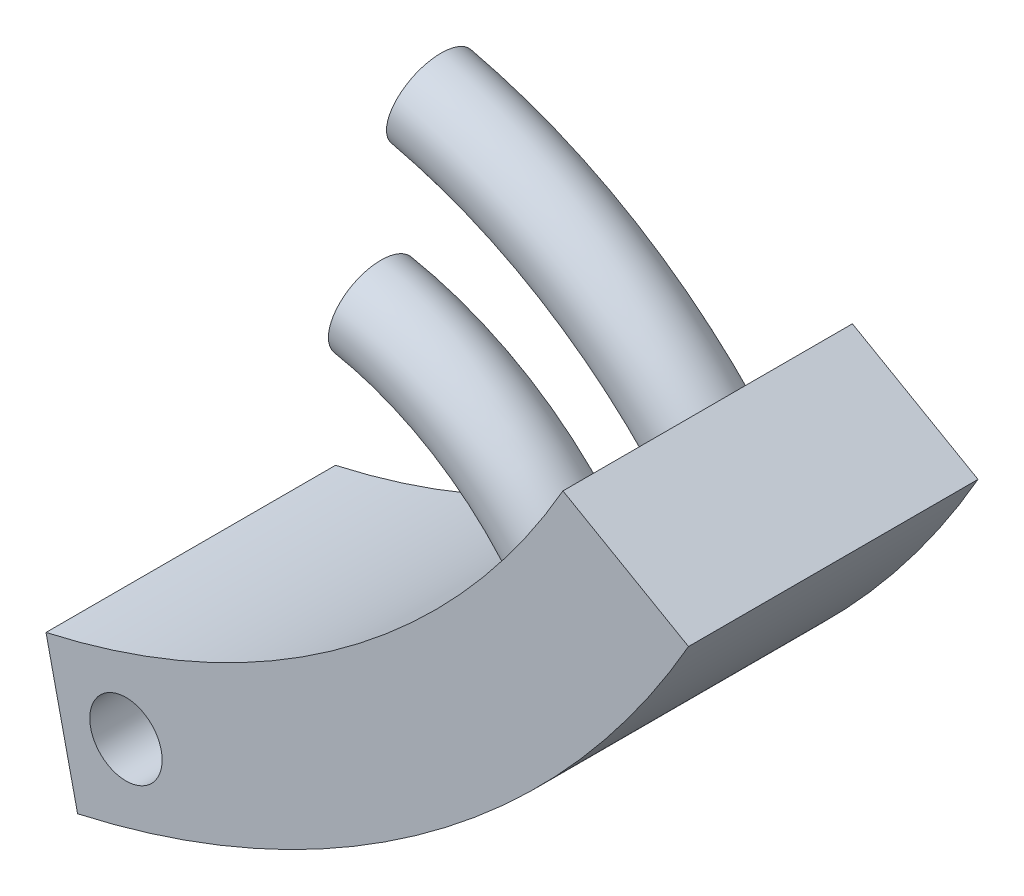
ISO-10303-21;
HEADER;
FILE_DESCRIPTION(('STEP AP214'),'2;1');
FILE_NAME('part.step','',(''),(''),'','','');
FILE_SCHEMA(('AUTOMOTIVE_DESIGN { 1 0 10303 214 1 1 1 1 }'));
ENDSEC;
DATA;
#1=APPLICATION_CONTEXT('core data for automotive mechanical design processes');
#2=APPLICATION_PROTOCOL_DEFINITION('international standard','automotive_design',2000,#1);
#3=PRODUCT_CONTEXT('',#1,'mechanical');
#4=PRODUCT('Part','Part','',(#3));
#5=PRODUCT_RELATED_PRODUCT_CATEGORY('part','',(#4));
#6=PRODUCT_DEFINITION_FORMATION('','',#4);
#7=PRODUCT_DEFINITION_CONTEXT('part definition',#1,'design');
#8=PRODUCT_DEFINITION('design','',#6,#7);
#9=PRODUCT_DEFINITION_SHAPE('','',#8);
#10=(LENGTH_UNIT() NAMED_UNIT(*) SI_UNIT(.MILLI.,.METRE.));
#11=(NAMED_UNIT(*) PLANE_ANGLE_UNIT() SI_UNIT($,.RADIAN.));
#12=(NAMED_UNIT(*) SI_UNIT($,.STERADIAN.) SOLID_ANGLE_UNIT());
#13=UNCERTAINTY_MEASURE_WITH_UNIT(LENGTH_MEASURE(1.E-05),#10,'distance_accuracy_value','');
#14=(GEOMETRIC_REPRESENTATION_CONTEXT(3) GLOBAL_UNCERTAINTY_ASSIGNED_CONTEXT((#13)) GLOBAL_UNIT_ASSIGNED_CONTEXT((#10,
#11,#12)) REPRESENTATION_CONTEXT('',''));
#15=CARTESIAN_POINT('',(0.,0.,0.));
#16=DIRECTION('',(0.,0.,1.));
#17=DIRECTION('',(1.,0.,0.));
#18=AXIS2_PLACEMENT_3D('',#15,#16,#17);
#19=CARTESIAN_POINT('',(-24.0074560773892,107.348227990462,40.));
#20=DIRECTION('',(0.,0.,-1.));
#21=DIRECTION('',(-1.,0.,0.));
#22=AXIS2_PLACEMENT_3D('',#19,#20,#21);
#23=CYLINDRICAL_SURFACE('',#22,110.);
#24=CARTESIAN_POINT('',(41.4872896276513,18.9715439327759,11.8788723896433));
#25=CARTESIAN_POINT('',(41.5581029483642,19.0240227829249,11.7346778512814));
#26=CARTESIAN_POINT('',(41.6337398664815,19.0802077786677,11.5942249832102));
#27=CARTESIAN_POINT('',(41.7940965349835,19.1996847735885,11.3217114701984));
#28=CARTESIAN_POINT('',(41.8788186824328,19.2629786485966,11.1896530547771));
#29=CARTESIAN_POINT('',(42.0567365252339,19.3963387409074,10.9347971907029));
#30=CARTESIAN_POINT('',(42.1499397928316,19.4664110137949,10.8120082006427));
#31=CARTESIAN_POINT('',(42.3440632635298,19.6128835347469,10.5766428327947));
#32=CARTESIAN_POINT('',(42.4449862844209,19.6892860942868,10.464070217188));
#33=CARTESIAN_POINT('',(42.6536445466986,19.8478576198827,10.2500803844772));
#34=CARTESIAN_POINT('',(42.7613736191462,19.930021371267,10.1486532873129));
#35=CARTESIAN_POINT('',(42.9829422277576,20.0996978668108,9.95752042492524));
#36=CARTESIAN_POINT('',(43.0967840008628,20.1872125707978,9.86781899252025));
#37=CARTESIAN_POINT('',(43.3296059109855,20.36695590176,9.70087053645461));
#38=CARTESIAN_POINT('',(43.4485828053261,20.4591815604687,9.62361579484584));
#39=CARTESIAN_POINT('',(43.690892842352,20.6478408199491,9.4820178801333));
#40=CARTESIAN_POINT('',(43.8142275749008,20.7442759595436,9.41767947768758));
#41=CARTESIAN_POINT('',(44.0643137314607,20.9407084178919,9.30240259320062));
#42=CARTESIAN_POINT('',(44.1910657145626,21.0407063204147,9.25146631870787));
#43=CARTESIAN_POINT('',(44.4470777145705,21.2436201580217,9.16336032275113));
#44=CARTESIAN_POINT('',(44.5763386415629,21.3465371584593,9.12619569883163));
#45=CARTESIAN_POINT('',(44.8363309542722,21.5545179114067,9.06594225260509));
#46=CARTESIAN_POINT('',(44.9670618271794,21.6595809250948,9.04284866765544));
#47=CARTESIAN_POINT('',(45.2291355419176,21.8711974093372,9.01088393379467));
#48=CARTESIAN_POINT('',(45.3604785914881,21.9777514148066,9.00201802846852));
#49=CARTESIAN_POINT('',(45.6224538770229,22.1912897898739,8.99860041465761));
#50=CARTESIAN_POINT('',(45.7530870695226,22.2982724104221,9.00401286984684));
#51=CARTESIAN_POINT('',(46.0130917933011,22.5122024127321,9.02904605142538));
#52=CARTESIAN_POINT('',(46.1424628412584,22.6191497669257,9.04867201973605));
#53=CARTESIAN_POINT('',(46.3989462171863,22.8321568978966,9.1020008217509));
#54=CARTESIAN_POINT('',(46.5260593857459,22.9382169968673,9.13569829717284));
#55=CARTESIAN_POINT('',(46.7772022964633,23.1487085789267,9.21691802306479));
#56=CARTESIAN_POINT('',(46.9012308836372,23.2531394466731,9.26444536981828));
#57=CARTESIAN_POINT('',(47.2668507316443,23.5623435006888,9.42710422908561));
#58=CARTESIAN_POINT('',(47.5027270019068,23.7636525632089,9.56246980532891));
#59=CARTESIAN_POINT('',(47.9522283389836,24.1503189632157,9.88322848031221));
#60=CARTESIAN_POINT('',(48.1658534287533,24.3356763171589,10.0686215274407));
#61=CARTESIAN_POINT('',(48.5654604654844,24.6848005823746,10.4842499562183));
#62=CARTESIAN_POINT('',(48.7514395468562,24.848565255304,10.7144899806812));
#63=CARTESIAN_POINT('',(49.0909268630662,25.1492134698724,11.2132601833072));
#64=CARTESIAN_POINT('',(49.2444349188901,25.2860968633132,11.4817905725534));
#65=CARTESIAN_POINT('',(49.5152543635945,25.5286445392429,12.0497743347548));
#66=CARTESIAN_POINT('',(49.6325359709995,25.6342831326172,12.3492528814794));
#67=CARTESIAN_POINT('',(49.8278264593756,25.8107000029427,12.9704557813343));
#68=CARTESIAN_POINT('',(49.9058353518229,25.8814782900807,13.292180127964));
#69=CARTESIAN_POINT('',(50.0206787726625,25.98582062592,13.9487908152241));
#70=CARTESIAN_POINT('',(50.0575078615316,26.0193797582634,14.2836788886313));
#71=CARTESIAN_POINT('',(50.0890756406162,26.0481390531663,14.9570661655943));
#72=CARTESIAN_POINT('',(50.08381439035,26.0433392699676,15.295565364043));
#73=CARTESIAN_POINT('',(50.031336771969,25.9955489752729,15.9664708304101));
#74=CARTESIAN_POINT('',(49.9841315542482,25.9525686137114,16.2988786936825));
#75=CARTESIAN_POINT('',(49.848931674191,25.8298726992145,16.9482614071567));
#76=CARTESIAN_POINT('',(49.7609369360814,25.7501570780373,17.265236228688));
#77=CARTESIAN_POINT('',(49.5463018736307,25.5566302112383,17.8748050803442));
#78=CARTESIAN_POINT('',(49.419656205013,25.4428142505915,18.1673957317352));
#79=CARTESIAN_POINT('',(49.1308665393597,25.1848351492631,18.7198505234656));
#80=CARTESIAN_POINT('',(48.9687224768668,25.0406719526227,18.9797146034574));
#81=CARTESIAN_POINT('',(48.6129969367196,24.7266450749255,19.4593828257447));
#82=CARTESIAN_POINT('',(48.4194103021541,24.5567771783415,19.6791803841395));
#83=CARTESIAN_POINT('',(48.0058061944814,24.1967692366009,20.0724166766981));
#84=CARTESIAN_POINT('',(47.7857888547793,24.006629293765,20.2458556448354));
#85=CARTESIAN_POINT('',(47.3252663659396,23.6121278072934,20.5413553580938));
#86=CARTESIAN_POINT('',(47.084773622788,23.4077748888087,20.6634469517777));
#87=CARTESIAN_POINT('',(46.5896837167929,22.9909610472309,20.8529415717925));
#88=CARTESIAN_POINT('',(46.3350866445329,22.7785001762129,20.9203449493087));
#89=CARTESIAN_POINT('',(45.8190073599826,22.3518928310308,20.9985543800373));
#90=CARTESIAN_POINT('',(45.5575298188548,22.137747566288,21.0093978838473));
#91=CARTESIAN_POINT('',(45.0349010632275,21.713736418787,20.9743210920529));
#92=CARTESIAN_POINT('',(44.7737498499912,21.5038705525474,20.9284005773817));
#93=CARTESIAN_POINT('',(44.2590798014445,21.0940192921413,20.7811204337107));
#94=CARTESIAN_POINT('',(44.0055686118108,20.8940436751384,20.679707095419));
#95=CARTESIAN_POINT('',(43.513727088045,20.5093700298796,20.4241800849142));
#96=CARTESIAN_POINT('',(43.2753970458567,20.3246722954074,20.270065399581));
#97=CARTESIAN_POINT('',(42.9346390705925,20.0626237476258,20.0027297726687));
#98=CARTESIAN_POINT('',(42.8236660891888,19.9776406301719,19.9073952003878));
#99=CARTESIAN_POINT('',(42.6081913868737,19.8132417542047,19.7053239422896));
#100=CARTESIAN_POINT('',(42.5036873049488,19.7338239630488,19.5985914556979));
#101=CARTESIAN_POINT('',(42.3019131382971,19.5810154405481,19.3744269974837));
#102=CARTESIAN_POINT('',(42.2046458238628,19.5076270161839,19.2569909663468));
#103=CARTESIAN_POINT('',(42.0181671568072,19.3673739286546,19.0123214463919));
#104=CARTESIAN_POINT('',(41.9289528341448,19.3005068595964,18.8850916019926));
#105=CARTESIAN_POINT('',(41.7591388383575,19.1735930398642,18.6215333196601));
#106=CARTESIAN_POINT('',(41.6785497859302,19.1135546921392,18.4851939926646));
#107=CARTESIAN_POINT('',(41.5267791546721,19.0007721622188,18.2045712514125));
#108=CARTESIAN_POINT('',(41.4555940884834,18.9480252757318,18.0602908103026));
#109=CARTESIAN_POINT('',(41.32314701859,18.8500975682805,17.7647139049625));
#110=CARTESIAN_POINT('',(41.2618882136382,18.80491918612,17.613415199209));
#111=CARTESIAN_POINT('',(41.1498403654288,18.72243286614,17.3049786567719));
#112=CARTESIAN_POINT('',(41.0990474029802,18.6851219820206,17.1478430319781));
#113=CARTESIAN_POINT('',(41.0084333220448,18.6186541295225,16.8292015948345));
#114=CARTESIAN_POINT('',(40.9685849450474,18.5894769007501,16.6677077604904));
#115=CARTESIAN_POINT('',(40.900032442065,18.5393335088511,16.3411843246308));
#116=CARTESIAN_POINT('',(40.8713241496564,18.5183642758848,16.1761560694129));
#117=CARTESIAN_POINT('',(40.8252550513629,18.4847350191718,15.843585661385));
#118=CARTESIAN_POINT('',(40.8079009813452,18.4720799277526,15.6760420765355));
#119=CARTESIAN_POINT('',(40.7847165588596,18.4551766783434,15.3398006815927));
#120=CARTESIAN_POINT('',(40.7788819150342,18.4509253896653,15.1711033248273));
#121=CARTESIAN_POINT('',(40.778772391199,18.4508455730962,14.8341977431629));
#122=CARTESIAN_POINT('',(40.7844636701187,18.4549923876738,14.6659895342703));
#123=CARTESIAN_POINT('',(40.8072862590218,18.4716316659259,14.3308292463329));
#124=CARTESIAN_POINT('',(40.8244133651719,18.484121062851,14.1638767284915));
#125=CARTESIAN_POINT('',(40.8699430753418,18.5173556967242,13.832494369242));
#126=CARTESIAN_POINT('',(40.8983358810544,18.5380937594592,13.6680624642782));
#127=CARTESIAN_POINT('',(40.9661499471253,18.5876946561533,13.342793032156));
#128=CARTESIAN_POINT('',(41.005568376059,18.6165554041857,13.1819545936171));
#129=CARTESIAN_POINT('',(41.1067407579352,18.6907619715886,12.8238291998541));
#130=CARTESIAN_POINT('',(41.1716357624784,18.7384417198665,12.6279005810957));
#131=CARTESIAN_POINT('',(41.3175987431462,18.8459940462366,12.2456519784958));
#132=CARTESIAN_POINT('',(41.3986666949873,18.9058666060214,12.0593319802276));
#133=CARTESIAN_POINT('',(41.4872896276513,18.9715439327759,11.8788723896433));
#134=B_SPLINE_CURVE_WITH_KNOTS('',3,(#24,#25,#26,#27,#28,#29,#30,#31,#32,#33,#34,#35,#36,#37,
#38,#39,#40,#41,#42,#43,#44,#45,#46,#47,#48,#49,#50,#51,#52,#53,#54,#55,#56,#57,#58,#59,#60,#61,
#62,#63,#64,#65,#66,#67,#68,#69,#70,#71,#72,#73,#74,#75,#76,#77,#78,#79,#80,#81,#82,#83,#84,#85,
#86,#87,#88,#89,#90,#91,#92,#93,#94,#95,#96,#97,#98,#99,#100,#101,#102,#103,#104,#105,#106,#107,
#108,#109,#110,#111,#112,#113,#114,#115,#116,#117,#118,#119,#120,#121,#122,#123,#124,#125,#126,
#127,#128,#129,#130,#131,#132,#133),.UNSPECIFIED.,.T.,.F.,(4,2,2,2,2,2,2,2,2,2,2,2,2,2,2,2,2,2,
2,2,2,2,2,2,2,2,2,2,2,2,2,2,2,2,2,2,2,2,2,2,2,2,2,2,2,2,2,2,2,2,2,2,2,2,4),(0.,
0.506811149602438,1.01375634777578,1.52115869084737,2.02874713308038,2.53588192534999,
3.04320358538181,3.55020944431666,4.0574022230494,4.56467849245837,5.07214234188464,
5.57943433381824,6.08691324437376,6.5931196792186,7.09951289733307,7.60571346180965,
8.11210079704624,9.12194537712251,10.1317889153839,11.141737054003,12.1516907603727,
13.1624725453775,14.1732540350148,15.18416902505,16.1950825855933,17.2057274850206,
18.2163742618962,19.2271608445858,20.237949291131,21.2489036852847,22.2598529770155,
23.2701940382764,24.2805286114889,25.2901941160012,26.2998635170829,27.3105118698593,
28.3211796522302,28.8282621706904,29.3351585098863,29.8422479051728,30.3491495089945,
30.8566682723424,31.3639982968002,31.8714914853849,32.3787942839457,32.8848218976547,
33.390660072757,33.8967980637797,34.4027474664812,34.9072135132738,35.4114942193466,
35.9153372868866,36.4190510840908,37.053326632412,37.6876012283832),.UNSPECIFIED.);
#135=CARTESIAN_POINT('',(41.4872896276513,18.9715439327759,11.8788723896433));
#136=VERTEX_POINT('',#135);
#137=EDGE_CURVE('E55',#136,#136,#134,.T.);
#138=ORIENTED_EDGE('',*,*,#137,.T.);
#139=EDGE_LOOP('',(#138));
#140=FACE_BOUND('',#139,.T.);
#141=CARTESIAN_POINT('',(-24.0074560773892,107.348227990462,0.));
#142=DIRECTION('',(0.,0.,-1.));
#143=DIRECTION('',(1.,0.,0.));
#144=AXIS2_PLACEMENT_3D('',#141,#142,#143);
#145=CIRCLE('',#144,110.);
#146=CARTESIAN_POINT('',(71.4284233444876,52.6491153927882,0.));
#147=VERTEX_POINT('',#146);
#148=CARTESIAN_POINT('',(0.,0.,0.));
#149=VERTEX_POINT('',#148);
#150=EDGE_CURVE('E132',#147,#149,#145,.T.);
#151=ORIENTED_EDGE('',*,*,#150,.T.);
#152=DIRECTION('',(0.,0.,-1.));
#153=VECTOR('',#152,1.);
#154=CARTESIAN_POINT('',(0.,0.,40.));
#155=LINE('',#154,#153);
#156=CARTESIAN_POINT('',(0.,0.,40.));
#157=VERTEX_POINT('',#156);
#158=EDGE_CURVE('E113',#157,#149,#155,.T.);
#159=ORIENTED_EDGE('',*,*,#158,.F.);
#160=CARTESIAN_POINT('',(-24.0074560773892,107.348227990462,40.));
#161=DIRECTION('',(0.,0.,-1.));
#162=DIRECTION('',(1.,0.,0.));
#163=AXIS2_PLACEMENT_3D('',#160,#161,#162);
#164=CIRCLE('',#163,110.);
#165=CARTESIAN_POINT('',(71.4284233444876,52.6491153927882,40.));
#166=VERTEX_POINT('',#165);
#167=EDGE_CURVE('E149',#166,#157,#164,.T.);
#168=ORIENTED_EDGE('',*,*,#167,.F.);
#169=DIRECTION('',(0.,0.,-1.));
#170=VECTOR('',#169,1.);
#171=CARTESIAN_POINT('',(71.4284233444876,52.6491153927882,40.));
#172=LINE('',#171,#170);
#173=EDGE_CURVE('E134',#166,#147,#172,.T.);
#174=ORIENTED_EDGE('',*,*,#173,.T.);
#175=EDGE_LOOP('',(#151,#159,#168,#174));
#176=FACE_BOUND('',#175,.T.);
#177=DIRECTION('',(0.,0.,-1.));
#178=VECTOR('',#177,1.);
#179=CARTESIAN_POINT('',(67.7433866517025,46.6705314413883,40.));
#180=LINE('',#179,#178);
#181=CARTESIAN_POINT('',(67.7433866517025,46.6705314413883,9.950269974268));
#182=VERTEX_POINT('',#181);
#183=CARTESIAN_POINT('',(67.7433866517025,46.6705314413883,20.049730025732));
#184=VERTEX_POINT('',#183);
#185=EDGE_CURVE('E12',#182,#184,#180,.F.);
#186=ORIENTED_EDGE('',*,*,#185,.F.);
#187=CARTESIAN_POINT('',(62.2159762759423,39.0436182396519,14.9258049793913));
#188=CARTESIAN_POINT('',(62.2172578141374,39.0452405187402,14.7594064808959));
#189=CARTESIAN_POINT('',(62.2229247099796,39.0523897365476,14.5930999605847));
#190=CARTESIAN_POINT('',(62.2429167858489,39.0776369135093,14.2618486827113));
#191=CARTESIAN_POINT('',(62.2572416941051,39.0957345289989,14.09690388257));
#192=CARTESIAN_POINT('',(62.2944674831785,39.1428114507469,13.7692790082415));
#193=CARTESIAN_POINT('',(62.3173821719542,39.1718082775481,13.6066030202011));
#194=CARTESIAN_POINT('',(62.3715739362299,39.2404817594897,13.2849489109374));
#195=CARTESIAN_POINT('',(62.4028506433368,39.2801579441459,13.125970627145));
#196=CARTESIAN_POINT('',(62.4739116125329,39.3704641431152,12.8109539374715));
#197=CARTESIAN_POINT('',(62.5137930049329,39.4212193014103,12.6549733060825));
#198=CARTESIAN_POINT('',(62.6014754393999,39.5330525003628,12.349055014605));
#199=CARTESIAN_POINT('',(62.6492764826192,39.5941305425222,12.1991173553958));
#200=CARTESIAN_POINT('',(62.7522241834461,39.7260063703442,11.9067597864921));
#201=CARTESIAN_POINT('',(62.8073501902428,39.7967768473486,11.7643202587336));
#202=CARTESIAN_POINT('',(62.9245439207001,39.9476605770607,11.4875635667824));
#203=CARTESIAN_POINT('',(62.9866074898214,40.0277682394371,11.3532416148744));
#204=CARTESIAN_POINT('',(63.0754602526426,40.1428176866745,11.1765022851233));
#205=CARTESIAN_POINT('',(63.0994772783039,40.1739489714204,11.1301511903523));
#206=CARTESIAN_POINT('',(63.1483248092202,40.2373387111674,11.0386585427653));
#207=CARTESIAN_POINT('',(63.1731553726123,40.2695972467353,10.993517076813));
#208=CARTESIAN_POINT('',(63.2693745661346,40.3947486706138,10.8237086046077));
#209=CARTESIAN_POINT('',(63.3435006655346,40.4914675512345,10.7033468755067));
#210=CARTESIAN_POINT('',(63.497366580912,40.6929799435672,10.4733433545429));
#211=CARTESIAN_POINT('',(63.5771098216889,40.7977783851725,10.363708201753));
#212=CARTESIAN_POINT('',(63.7416736160077,41.0149118810061,10.1557426665914));
#213=CARTESIAN_POINT('',(63.8265041206316,41.1272617619312,10.057435617355));
#214=CARTESIAN_POINT('',(64.0004189921805,41.3585707058738,9.87300467335599));
#215=CARTESIAN_POINT('',(64.0895050026555,41.4775323254072,9.7868855375006));
#216=CARTESIAN_POINT('',(64.2709929179867,41.7209589532579,9.62758925672314));
#217=CARTESIAN_POINT('',(64.3633877158504,41.845412285448,9.5543861649608));
#218=CARTESIAN_POINT('',(64.5509709679042,42.0992440116975,9.4211370447408));
#219=CARTESIAN_POINT('',(64.6461604378142,42.2286242016214,9.36109586880465));
#220=CARTESIAN_POINT('',(64.83848456229,42.4912677000545,9.25461112610519));
#221=CARTESIAN_POINT('',(64.9356173683988,42.6245273687335,9.20815523834062));
#222=CARTESIAN_POINT('',(65.1312278054566,42.8941917271185,9.1290163090752));
#223=CARTESIAN_POINT('',(65.2297059243158,43.0305975709087,9.09633840918539));
#224=CARTESIAN_POINT('',(65.4284969787519,43.3073060656898,9.04463163326866));
#225=CARTESIAN_POINT('',(65.5288174689862,43.4476361081698,9.02577832221427));
#226=CARTESIAN_POINT('',(65.7293904397233,43.7296118188039,9.00247550291367));
#227=CARTESIAN_POINT('',(65.8296428813252,43.8712579545576,8.99803132700317));
#228=CARTESIAN_POINT('',(66.029324637919,44.1548091779208,9.00355811882878));
#229=CARTESIAN_POINT('',(66.1287541013903,44.2967142129221,9.01352642665966));
#230=CARTESIAN_POINT('',(66.3261684148349,44.5798753961674,9.04778989954147));
#231=CARTESIAN_POINT('',(66.4241527140751,44.7211312835982,9.07209038881799));
#232=CARTESIAN_POINT('',(66.6191968574272,45.0037044584527,9.13524163124978));
#233=CARTESIAN_POINT('',(66.7162299552188,45.145000564904,9.17426997174814));
#234=CARTESIAN_POINT('',(66.9074929843703,45.4248819473795,9.26658930385634));
#235=CARTESIAN_POINT('',(67.0017218549706,45.5634661909619,9.31988561831227));
#236=CARTESIAN_POINT('',(67.1866923965473,45.8368104229433,9.44037360025015));
#237=CARTESIAN_POINT('',(67.2774352437441,45.9715716971653,9.50756053118708));
#238=CARTESIAN_POINT('',(67.4548805460481,46.2363106181905,9.655390930412));
#239=CARTESIAN_POINT('',(67.5415815030986,46.3662864876721,9.73603933802826));
#240=CARTESIAN_POINT('',(67.7947290607687,46.7474734332383,9.99744394324567));
#241=CARTESIAN_POINT('',(67.9543767648166,46.9901755148864,10.1977616488732));
#242=CARTESIAN_POINT('',(68.2508770998548,47.4443561849981,10.6449616839855));
#243=CARTESIAN_POINT('',(68.3877314763387,47.6558371642061,10.8918404447742));
#244=CARTESIAN_POINT('',(68.6330394248948,48.0372742928692,11.4210733017846));
#245=CARTESIAN_POINT('',(68.7419282919976,48.2078637251662,11.7027676320902));
#246=CARTESIAN_POINT('',(68.9312586491774,48.5058398965176,12.2968877375767));
#247=CARTESIAN_POINT('',(69.0117048595829,48.6332338041348,12.6093084024206));
#248=CARTESIAN_POINT('',(69.140142722641,48.8372115159606,13.2469514421427));
#249=CARTESIAN_POINT('',(69.188953033281,48.9150759328134,13.5715993281921));
#250=CARTESIAN_POINT('',(69.2561681648955,49.0224148150069,14.2318471009435));
#251=CARTESIAN_POINT('',(69.2745774481955,49.0518963820781,14.5674453729496));
#252=CARTESIAN_POINT('',(69.2804195506381,49.0612460434071,15.2323896876918));
#253=CARTESIAN_POINT('',(69.2685065190823,49.0421618579754,15.5617159225033));
#254=CARTESIAN_POINT('',(69.2154051315194,48.9572987911532,16.2118636825349));
#255=CARTESIAN_POINT('',(69.1742177574256,48.8915214759332,16.532685492634));
#256=CARTESIAN_POINT('',(69.0637821047747,48.7158540337495,17.1561935309765));
#257=CARTESIAN_POINT('',(68.9945905370002,48.6060530624773,17.458915000304));
#258=CARTESIAN_POINT('',(68.8299212014463,48.3461524127666,18.0388225773734));
#259=CARTESIAN_POINT('',(68.7344414432454,48.196049682885,18.3160067494264));
#260=CARTESIAN_POINT('',(68.517621610669,47.8574633653316,18.8424715595241));
#261=CARTESIAN_POINT('',(68.3958431492217,47.6683319130439,19.091153631385));
#262=CARTESIAN_POINT('',(68.1303866881985,47.2593179779889,19.5485433031921));
#263=CARTESIAN_POINT('',(67.9867057146804,47.0394313195876,19.7572454659339));
#264=CARTESIAN_POINT('',(67.7554932362143,46.6886731211355,20.038851980312));
#265=CARTESIAN_POINT('',(67.6746149084726,46.5664839718536,20.1284554785733));
#266=CARTESIAN_POINT('',(67.508530809572,46.3167067558179,20.295236868936));
#267=CARTESIAN_POINT('',(67.4233264857533,46.1891204971171,20.3724188813007));
#268=CARTESIAN_POINT('',(67.2490769818412,45.9294226662119,20.5139100982176));
#269=CARTESIAN_POINT('',(67.1600300368426,45.7973090204516,20.5782133094122));
#270=CARTESIAN_POINT('',(66.9787151172733,45.529599952302,20.6934933159898));
#271=CARTESIAN_POINT('',(66.8864482764636,45.3940057598115,20.7444747495069));
#272=CARTESIAN_POINT('',(66.6972957706462,45.1173944476721,20.8337372940492));
#273=CARTESIAN_POINT('',(66.6003539341553,44.9763231997953,20.8717318339182));
#274=CARTESIAN_POINT('',(66.4043709836766,44.6925718431308,20.9332578519775));
#275=CARTESIAN_POINT('',(66.3053306213979,44.5498923187338,20.9567944214653));
#276=CARTESIAN_POINT('',(66.1057588702044,44.2638486854928,20.9892581311511));
#277=CARTESIAN_POINT('',(66.0052270329805,44.1204843799711,20.9981807850755));
#278=CARTESIAN_POINT('',(65.8034393743094,43.8341845173875,21.0013167733702));
#279=CARTESIAN_POINT('',(65.7021838376506,43.6912488200444,20.9955356069723));
#280=CARTESIAN_POINT('',(65.4991386830085,43.4060644150101,20.9692161764109));
#281=CARTESIAN_POINT('',(65.3973488714386,43.2638224701269,20.9486059903129));
#282=CARTESIAN_POINT('',(65.1945227547759,42.9817993857788,20.8926593359439));
#283=CARTESIAN_POINT('',(65.0934861800165,42.8420173385917,20.85732842376));
#284=CARTESIAN_POINT('',(64.8928063756626,42.5657263676196,20.7721004047174));
#285=CARTESIAN_POINT('',(64.7931645111545,42.4292205682592,20.7221899480629));
#286=CARTESIAN_POINT('',(64.5961928239242,42.1606438549224,20.6081389068917));
#287=CARTESIAN_POINT('',(64.4988621080356,42.0285712192672,20.5440039220358));
#288=CARTESIAN_POINT('',(64.3080914810205,41.7708725851911,20.4025145983354));
#289=CARTESIAN_POINT('',(64.2146252128475,41.6452007353193,20.3252793025303));
#290=CARTESIAN_POINT('',(64.0315053813019,41.4000311378744,20.1577445463155));
#291=CARTESIAN_POINT('',(63.94185028382,41.2805309017998,20.06745040816));
#292=CARTESIAN_POINT('',(63.76724990009,41.0487407466969,19.8745798092795));
#293=CARTESIAN_POINT('',(63.6822954890407,40.9364367863191,19.7720284598365));
#294=CARTESIAN_POINT('',(63.5176701771067,40.7196246138252,19.5552419746235));
#295=CARTESIAN_POINT('',(63.4379959689775,40.6151115166973,19.4410142685301));
#296=CARTESIAN_POINT('',(63.3333421270381,40.4783013225543,19.2777198379836));
#297=CARTESIAN_POINT('',(63.3057664531244,40.4423002694896,19.2333497629476));
#298=CARTESIAN_POINT('',(63.2514467012921,40.3714717488183,19.1432170734499));
#299=CARTESIAN_POINT('',(63.2247023557098,40.3366439031642,19.0974549167876));
#300=CARTESIAN_POINT('',(63.1111968043704,40.1890084118676,18.8971331709673));
#301=CARTESIAN_POINT('',(63.0286587836006,40.0821101775611,18.7356878612502));
#302=CARTESIAN_POINT('',(62.8739776489859,39.882440548418,18.3992813824558));
#303=CARTESIAN_POINT('',(62.801850517035,39.7896908610556,18.224300053361));
#304=CARTESIAN_POINT('',(62.6822302280422,39.6362956202806,17.8986574346358));
#305=CARTESIAN_POINT('',(62.6326856052592,39.5729277120959,17.7500221935573));
#306=CARTESIAN_POINT('',(62.5414248847749,39.4564267469479,17.4463913934239));
#307=CARTESIAN_POINT('',(62.4997117010798,39.4032974995016,17.2913934929215));
#308=CARTESIAN_POINT('',(62.4244463498024,39.3075783760667,16.975887731833));
#309=CARTESIAN_POINT('',(62.3909108826021,39.2650100643956,16.8153693472472));
#310=CARTESIAN_POINT('',(62.3324087468566,39.1908378723901,16.4903343475504));
#311=CARTESIAN_POINT('',(62.307439879376,39.1592311783274,16.325818770095));
#312=CARTESIAN_POINT('',(62.2868947042957,39.1332367996137,16.1598697054516));
#313=B_SPLINE_CURVE_WITH_KNOTS('',3,(#187,#188,#189,#190,#191,#192,#193,#194,#195,#196,#197,
#198,#199,#200,#201,#202,#203,#204,#205,#206,#207,#208,#209,#210,#211,#212,#213,#214,#215,#216,
#217,#218,#219,#220,#221,#222,#223,#224,#225,#226,#227,#228,#229,#230,#231,#232,#233,#234,#235,
#236,#237,#238,#239,#240,#241,#242,#243,#244,#245,#246,#247,#248,#249,#250,#251,#252,#253,#254,
#255,#256,#257,#258,#259,#260,#261,#262,#263,#264,#265,#266,#267,#268,#269,#270,#271,#272,#273,
#274,#275,#276,#277,#278,#279,#280,#281,#282,#283,#284,#285,#286,#287,#288,#289,#290,#291,#292,
#293,#294,#295,#296,#297,#298,#299,#300,#301,#302,#303,#304,#305,#306,#307,#308,#309,#310,#311,
#312),.UNSPECIFIED.,.F.,.F.,(4,2,2,2,2,2,2,2,2,2,2,2,2,2,2,2,2,2,2,2,2,2,2,2,2,2,2,2,2,2,2,2,2,
2,2,2,2,2,2,2,2,2,2,2,2,2,2,2,2,2,2,2,2,2,2,2,2,2,2,2,2,2,4),(0.,0.49908006746151,
0.998144469858623,1.49801457606687,1.99786266386336,2.50367951906149,3.00949644785486,
3.51391647203328,4.01803602784151,4.20035961520704,4.38269626034979,4.89583979329786,
5.40929894670946,5.92379747916646,6.43849635232767,6.95214918150622,7.46599106637123,
7.97936547333049,8.49293128997242,9.01291122089787,9.53308355693641,10.0531599044869,
10.5734295756746,11.1001841852788,11.627135581786,12.1539075892381,12.6808733081785,
13.7339232868383,14.7868925867158,15.8223140150986,16.8575635247305,17.8648233529498,
18.8719353203502,19.8575056441093,20.8430429116521,21.8265942926168,22.8102201640751,
23.8117197329151,24.8133554075665,25.3281368054469,25.8427470944836,26.357596312087,
26.8722660393063,27.3976529747798,27.9228547918125,28.4482178084696,28.9733843681463,
29.5011153472286,30.0286473234271,30.5566638578496,31.0844728998353,31.607720191911,
32.1307548274562,32.6527357224323,33.1743865239021,33.3646950466857,33.5549416472466,
34.1851114231624,34.8162385208184,35.3226632189561,35.829275981182,36.3369148333793,
36.8444232835803),.UNSPECIFIED.);
#314=EDGE_CURVE('E64',#182,#184,#313,.T.);
#315=ORIENTED_EDGE('',*,*,#314,.T.);
#316=EDGE_LOOP('',(#186,#315));
#317=FACE_BOUND('',#316,.T.);
#318=ADVANCED_FACE('F51',(#140,#176,#317),#23,.F.);
#319=CARTESIAN_POINT('',(0.,0.,40.));
#320=DIRECTION('',(0.975892981731474,0.218249600703539,0.));
#321=DIRECTION('',(-0.218249600703539,0.975892981731474,0.));
#322=AXIS2_PLACEMENT_3D('',#319,#320,#321);
#323=PLANE('',#322);
#324=DIRECTION('',(0.218249600703539,-0.975892981731474,0.));
#325=VECTOR('',#324,1.);
#326=CARTESIAN_POINT('',(0.,0.,0.));
#327=LINE('',#326,#325);
#328=CARTESIAN_POINT('',(4.36499201407078,-19.5178596346295,0.));
#329=VERTEX_POINT('',#328);
#330=EDGE_CURVE('E136',#149,#329,#327,.T.);
#331=ORIENTED_EDGE('',*,*,#330,.T.);
#332=DIRECTION('',(0.,0.,-1.));
#333=VECTOR('',#332,1.);
#334=CARTESIAN_POINT('',(4.36499201407078,-19.5178596346295,40.));
#335=LINE('',#334,#333);
#336=CARTESIAN_POINT('',(4.36499201407078,-19.5178596346295,40.));
#337=VERTEX_POINT('',#336);
#338=EDGE_CURVE('E153',#337,#329,#335,.T.);
#339=ORIENTED_EDGE('',*,*,#338,.F.);
#340=DIRECTION('',(0.218249600703539,-0.975892981731474,0.));
#341=VECTOR('',#340,1.);
#342=CARTESIAN_POINT('',(0.,0.,40.));
#343=LINE('',#342,#341);
#344=EDGE_CURVE('E107',#157,#337,#343,.T.);
#345=ORIENTED_EDGE('',*,*,#344,.F.);
#346=ORIENTED_EDGE('',*,*,#158,.T.);
#347=EDGE_LOOP('',(#331,#339,#345,#346));
#348=FACE_BOUND('',#347,.T.);
#349=ADVANCED_FACE('F120',(#348),#323,.F.);
#350=CARTESIAN_POINT('',(-24.0074560773892,107.348227990462,40.));
#351=DIRECTION('',(0.,0.,-1.));
#352=DIRECTION('',(-1.,0.,0.));
#353=AXIS2_PLACEMENT_3D('',#350,#351,#352);
#354=CYLINDRICAL_SURFACE('',#353,130.);
#355=CARTESIAN_POINT('',(-24.0074560773892,107.348227990462,0.));
#356=DIRECTION('',(0.,0.,1.));
#357=DIRECTION('',(1.,0.,0.));
#358=AXIS2_PLACEMENT_3D('',#355,#356,#357);
#359=CIRCLE('',#358,130.);
#360=CARTESIAN_POINT('',(88.7804014211924,42.7038221932111,0.));
#361=VERTEX_POINT('',#360);
#362=EDGE_CURVE('E139',#329,#361,#359,.T.);
#363=ORIENTED_EDGE('',*,*,#362,.T.);
#364=DIRECTION('',(0.,0.,-1.));
#365=VECTOR('',#364,1.);
#366=CARTESIAN_POINT('',(88.7804014211924,42.7038221932111,40.));
#367=LINE('',#366,#365);
#368=CARTESIAN_POINT('',(88.7804014211924,42.7038221932111,40.));
#369=VERTEX_POINT('',#368);
#370=EDGE_CURVE('E151',#369,#361,#367,.T.);
#371=ORIENTED_EDGE('',*,*,#370,.F.);
#372=CARTESIAN_POINT('',(-24.0074560773892,107.348227990462,40.));
#373=DIRECTION('',(0.,0.,1.));
#374=DIRECTION('',(1.,0.,0.));
#375=AXIS2_PLACEMENT_3D('',#372,#373,#374);
#376=CIRCLE('',#375,130.);
#377=EDGE_CURVE('E196',#337,#369,#376,.T.);
#378=ORIENTED_EDGE('',*,*,#377,.F.);
#379=ORIENTED_EDGE('',*,*,#338,.T.);
#380=EDGE_LOOP('',(#363,#371,#378,#379));
#381=FACE_BOUND('',#380,.T.);
#382=ADVANCED_FACE('F125',(#381),#354,.T.);
#383=CARTESIAN_POINT('',(71.4284233444876,52.6491153927882,40.));
#384=DIRECTION('',(-0.497264659978855,-0.867598903835242,0.));
#385=DIRECTION('',(0.867598903835242,-0.497264659978855,0.));
#386=AXIS2_PLACEMENT_3D('',#383,#384,#385);
#387=PLANE('',#386);
#388=DIRECTION('',(-0.867598903835242,0.497264659978855,0.));
#389=VECTOR('',#388,1.);
#390=CARTESIAN_POINT('',(71.4284233444876,52.6491153927882,0.));
#391=LINE('',#390,#389);
#392=EDGE_CURVE('E99',#361,#147,#391,.T.);
#393=ORIENTED_EDGE('',*,*,#392,.T.);
#394=ORIENTED_EDGE('',*,*,#173,.F.);
#395=DIRECTION('',(-0.867598903835242,0.497264659978855,0.));
#396=VECTOR('',#395,1.);
#397=CARTESIAN_POINT('',(71.4284233444876,52.6491153927882,40.));
#398=LINE('',#397,#396);
#399=EDGE_CURVE('E78',#369,#166,#398,.T.);
#400=ORIENTED_EDGE('',*,*,#399,.F.);
#401=ORIENTED_EDGE('',*,*,#370,.T.);
#402=EDGE_LOOP('',(#393,#394,#400,#401));
#403=FACE_BOUND('',#402,.T.);
#404=ADVANCED_FACE('F182',(#403),#387,.F.);
#405=CARTESIAN_POINT('',(-24.0074560773892,107.348227990462,40.));
#406=DIRECTION('',(0.,0.,1.));
#407=DIRECTION('',(1.,0.,0.));
#408=AXIS2_PLACEMENT_3D('',#405,#406,#407);
#409=PLANE('',#408);
#410=CARTESIAN_POINT('',(11.0480991159521,-7.24797555375026,40.));
#411=DIRECTION('',(0.,0.,1.));
#412=DIRECTION('',(1.,0.,0.));
#413=AXIS2_PLACEMENT_3D('',#410,#411,#412);
#414=CIRCLE('',#413,5.);
#415=CARTESIAN_POINT('',(16.0480991159521,-7.24797555375026,40.));
#416=VERTEX_POINT('',#415);
#417=EDGE_CURVE('E137',#416,#416,#414,.T.);
#418=ORIENTED_EDGE('',*,*,#417,.F.);
#419=EDGE_LOOP('',(#418));
#420=FACE_BOUND('',#419,.T.);
#421=ORIENTED_EDGE('',*,*,#167,.T.);
#422=ORIENTED_EDGE('',*,*,#344,.T.);
#423=ORIENTED_EDGE('',*,*,#377,.T.);
#424=ORIENTED_EDGE('',*,*,#399,.T.);
#425=EDGE_LOOP('',(#421,#422,#423,#424));
#426=FACE_BOUND('',#425,.T.);
#427=ADVANCED_FACE('F179',(#420,#426),#409,.T.);
#428=CARTESIAN_POINT('',(-24.0074560773892,107.348227990462,0.));
#429=DIRECTION('',(0.,0.,1.));
#430=DIRECTION('',(1.,0.,0.));
#431=AXIS2_PLACEMENT_3D('',#428,#429,#430);
#432=PLANE('',#431);
#433=CARTESIAN_POINT('',(11.0480991159521,-7.24797555375026,0.));
#434=DIRECTION('',(0.,0.,1.));
#435=DIRECTION('',(1.,0.,0.));
#436=AXIS2_PLACEMENT_3D('',#433,#434,#435);
#437=CIRCLE('',#436,5.);
#438=CARTESIAN_POINT('',(16.0480991159521,-7.24797555375026,0.));
#439=VERTEX_POINT('',#438);
#440=EDGE_CURVE('E142',#439,#439,#437,.T.);
#441=ORIENTED_EDGE('',*,*,#440,.T.);
#442=EDGE_LOOP('',(#441));
#443=FACE_BOUND('',#442,.T.);
#444=ORIENTED_EDGE('',*,*,#150,.F.);
#445=ORIENTED_EDGE('',*,*,#392,.F.);
#446=ORIENTED_EDGE('',*,*,#362,.F.);
#447=ORIENTED_EDGE('',*,*,#330,.F.);
#448=EDGE_LOOP('',(#444,#445,#446,#447));
#449=FACE_BOUND('',#448,.T.);
#450=ADVANCED_FACE('F177',(#443,#449),#432,.F.);
#451=CARTESIAN_POINT('',(11.0480991159521,-7.24797555375026,0.));
#452=DIRECTION('',(0.,0.,1.));
#453=DIRECTION('',(1.,0.,0.));
#454=AXIS2_PLACEMENT_3D('',#451,#452,#453);
#455=CYLINDRICAL_SURFACE('',#454,5.);
#456=ORIENTED_EDGE('',*,*,#417,.T.);
#457=EDGE_LOOP('',(#456));
#458=FACE_BOUND('',#457,.T.);
#459=ORIENTED_EDGE('',*,*,#440,.F.);
#460=EDGE_LOOP('',(#459));
#461=FACE_BOUND('',#460,.T.);
#462=ADVANCED_FACE('F174',(#458,#461),#455,.F.);
#463=CARTESIAN_POINT('',(65.3952941176161,44.4374420749301,15.));
#464=DIRECTION('',(-0.689138901715739,0.724629266688854,0.));
#465=DIRECTION('',(-0.724629266688854,-0.689138901715739,0.));
#466=AXIS2_PLACEMENT_3D('',#463,#464,#465);
#467=PLANE('',#466);
#468=CARTESIAN_POINT('',(65.3952941176161,44.4374420749301,15.));
#469=DIRECTION('',(-0.689138901715739,0.724629266688854,0.));
#470=DIRECTION('',(-0.724629266688854,-0.689138901715739,0.));
#471=AXIS2_PLACEMENT_3D('',#468,#469,#470);
#472=CIRCLE('',#471,6.);
#473=EDGE_CURVE('E70',#182,#184,#472,.T.);
#474=ORIENTED_EDGE('',*,*,#473,.F.);
#475=ORIENTED_EDGE('',*,*,#185,.T.);
#476=EDGE_LOOP('',(#474,#475));
#477=FACE_BOUND('',#476,.T.);
#478=ADVANCED_FACE('F116',(#477),#467,.F.);
#479=CARTESIAN_POINT('',(11.0480991159521,-7.24797555375026,15.));
#480=DIRECTION('',(0.,0.,1.));
#481=DIRECTION('',(1.,0.,0.));
#482=AXIS2_PLACEMENT_3D('',#479,#480,#481);
#483=TOROIDAL_SURFACE('',#482,75.,6.);
#484=CARTESIAN_POINT('',(28.2000023223176,65.7644358322564,15.));
#485=DIRECTION('',(-0.973498818480088,0.228692042751541,0.));
#486=DIRECTION('',(-0.228692042751541,-0.973498818480088,0.));
#487=AXIS2_PLACEMENT_3D('',#484,#485,#486);
#488=CIRCLE('',#487,6.);
#489=CARTESIAN_POINT('',(26.8278500658084,59.9234429213758,15.));
#490=VERTEX_POINT('',#489);
#491=EDGE_CURVE('E117',#490,#490,#488,.T.);
#492=ORIENTED_EDGE('',*,*,#491,.F.);
#493=EDGE_LOOP('',(#492));
#494=FACE_BOUND('',#493,.T.);
#495=ORIENTED_EDGE('',*,*,#314,.F.);
#496=ORIENTED_EDGE('',*,*,#473,.T.);
#497=EDGE_LOOP('',(#495,#496));
#498=FACE_BOUND('',#497,.T.);
#499=ADVANCED_FACE('F110',(#494,#498),#483,.T.);
#500=CARTESIAN_POINT('',(28.2000023223176,65.7644358322564,15.));
#501=DIRECTION('',(-0.973498818480088,0.228692042751541,0.));
#502=DIRECTION('',(-0.228692042751541,-0.973498818480088,0.));
#503=AXIS2_PLACEMENT_3D('',#500,#501,#502);
#504=PLANE('',#503);
#505=ORIENTED_EDGE('',*,*,#491,.T.);
#506=EDGE_LOOP('',(#505));
#507=FACE_BOUND('',#506,.T.);
#508=ADVANCED_FACE('F165',(#507),#504,.T.);
#509=CARTESIAN_POINT('',(11.5683857678498,-7.38997672063348,15.));
#510=DIRECTION('',(0.,0.,1.));
#511=DIRECTION('',(1.,0.,0.));
#512=AXIS2_PLACEMENT_3D('',#509,#510,#511);
#513=TOROIDAL_SURFACE('',#512,45.,6.);
#514=CARTESIAN_POINT('',(20.1267767164011,36.7886826566242,15.));
#515=DIRECTION('',(-0.981747986161281,0.190186465523363,0.));
#516=DIRECTION('',(-0.190186465523363,-0.981747986161281,0.));
#517=AXIS2_PLACEMENT_3D('',#514,#515,#516);
#518=CIRCLE('',#517,6.);
#519=CARTESIAN_POINT('',(18.9856579232609,30.8981947396565,15.));
#520=VERTEX_POINT('',#519);
#521=EDGE_CURVE('E204',#520,#520,#518,.T.);
#522=ORIENTED_EDGE('',*,*,#521,.F.);
#523=EDGE_LOOP('',(#522));
#524=FACE_BOUND('',#523,.T.);
#525=ORIENTED_EDGE('',*,*,#137,.F.);
#526=EDGE_LOOP('',(#525));
#527=FACE_BOUND('',#526,.T.);
#528=ADVANCED_FACE('F170',(#524,#527),#513,.T.);
#529=CARTESIAN_POINT('',(20.1267767164011,36.7886826566242,15.));
#530=DIRECTION('',(-0.981747986161281,0.190186465523363,0.));
#531=DIRECTION('',(-0.190186465523363,-0.981747986161281,0.));
#532=AXIS2_PLACEMENT_3D('',#529,#530,#531);
#533=PLANE('',#532);
#534=ORIENTED_EDGE('',*,*,#521,.T.);
#535=EDGE_LOOP('',(#534));
#536=FACE_BOUND('',#535,.T.);
#537=ADVANCED_FACE('F167',(#536),#533,.T.);
#538=CLOSED_SHELL('',(#318,#349,#382,#404,#427,#450,#462,#478,#499,#508,#528,#537));
#539=MANIFOLD_SOLID_BREP('B2',#538);
#540=ADVANCED_BREP_SHAPE_REPRESENTATION('',(#18,#539),#14);
#541=SHAPE_DEFINITION_REPRESENTATION(#9,#540);
ENDSEC;
END-ISO-10303-21;
